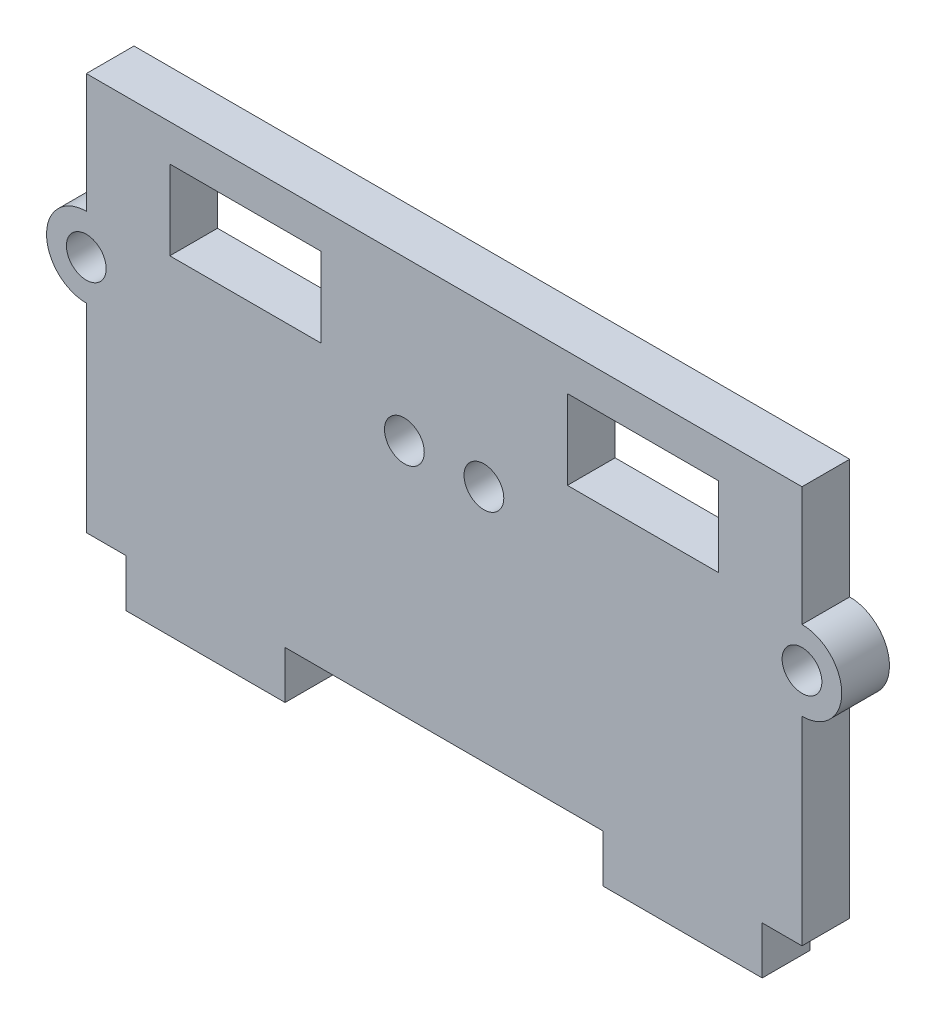
ISO-10303-21;
HEADER;
FILE_DESCRIPTION(('STEP AP214'),'2;1');
FILE_NAME('part.step','',(''),(''),'','','');
FILE_SCHEMA(('AUTOMOTIVE_DESIGN { 1 0 10303 214 1 1 1 1 }'));
ENDSEC;
DATA;
#1=APPLICATION_CONTEXT('core data for automotive mechanical design processes');
#2=APPLICATION_PROTOCOL_DEFINITION('international standard','automotive_design',2000,#1);
#3=PRODUCT_CONTEXT('',#1,'mechanical');
#4=PRODUCT('Part','Part','',(#3));
#5=PRODUCT_RELATED_PRODUCT_CATEGORY('part','',(#4));
#6=PRODUCT_DEFINITION_FORMATION('','',#4);
#7=PRODUCT_DEFINITION_CONTEXT('part definition',#1,'design');
#8=PRODUCT_DEFINITION('design','',#6,#7);
#9=PRODUCT_DEFINITION_SHAPE('','',#8);
#10=(LENGTH_UNIT() NAMED_UNIT(*) SI_UNIT(.MILLI.,.METRE.));
#11=(NAMED_UNIT(*) PLANE_ANGLE_UNIT() SI_UNIT($,.RADIAN.));
#12=(NAMED_UNIT(*) SI_UNIT($,.STERADIAN.) SOLID_ANGLE_UNIT());
#13=UNCERTAINTY_MEASURE_WITH_UNIT(LENGTH_MEASURE(1.E-05),#10,'distance_accuracy_value','');
#14=(GEOMETRIC_REPRESENTATION_CONTEXT(3) GLOBAL_UNCERTAINTY_ASSIGNED_CONTEXT((#13)) GLOBAL_UNIT_ASSIGNED_CONTEXT((#10,
#11,#12)) REPRESENTATION_CONTEXT('',''));
#15=CARTESIAN_POINT('',(0.,0.,0.));
#16=DIRECTION('',(0.,0.,1.));
#17=DIRECTION('',(1.,0.,0.));
#18=AXIS2_PLACEMENT_3D('',#15,#16,#17);
#19=CARTESIAN_POINT('',(0.,0.,1.5));
#20=DIRECTION('',(0.,0.,1.));
#21=DIRECTION('',(1.,0.,0.));
#22=AXIS2_PLACEMENT_3D('',#19,#20,#21);
#23=PLANE('',#22);
#24=CARTESIAN_POINT('',(10.,4.,1.5));
#25=DIRECTION('',(0.,0.,1.));
#26=DIRECTION('',(1.,0.,0.));
#27=AXIS2_PLACEMENT_3D('',#24,#25,#26);
#28=CIRCLE('',#27,1.25);
#29=CARTESIAN_POINT('',(11.25,4.,1.5));
#30=VERTEX_POINT('',#29);
#31=EDGE_CURVE('E324',#30,#30,#28,.T.);
#32=ORIENTED_EDGE('',*,*,#31,.F.);
#33=EDGE_LOOP('',(#32));
#34=FACE_BOUND('',#33,.T.);
#35=CARTESIAN_POINT('',(-10.,4.,1.5));
#36=DIRECTION('',(0.,0.,1.));
#37=DIRECTION('',(1.,0.,0.));
#38=AXIS2_PLACEMENT_3D('',#35,#36,#37);
#39=CIRCLE('',#38,1.25);
#40=CARTESIAN_POINT('',(-8.75,4.,1.5));
#41=VERTEX_POINT('',#40);
#42=EDGE_CURVE('E425',#41,#41,#39,.T.);
#43=ORIENTED_EDGE('',*,*,#42,.F.);
#44=EDGE_LOOP('',(#43));
#45=FACE_BOUND('',#44,.T.);
#46=DIRECTION('',(0.,1.,0.));
#47=VECTOR('',#46,1.);
#48=CARTESIAN_POINT('',(4.75,0.,1.5));
#49=LINE('',#48,#47);
#50=CARTESIAN_POINT('',(4.75,6.69999999999999,1.5));
#51=VERTEX_POINT('',#50);
#52=CARTESIAN_POINT('',(4.75,11.7,1.5));
#53=VERTEX_POINT('',#52);
#54=EDGE_CURVE('E429',#51,#53,#49,.T.);
#55=ORIENTED_EDGE('',*,*,#54,.F.);
#56=DIRECTION('',(1.,0.,0.));
#57=VECTOR('',#56,1.);
#58=CARTESIAN_POINT('',(0.,6.69999999999999,1.5));
#59=LINE('',#58,#57);
#60=CARTESIAN_POINT('',(-4.75,6.69999999999999,1.5));
#61=VERTEX_POINT('',#60);
#62=EDGE_CURVE('E433',#61,#51,#59,.T.);
#63=ORIENTED_EDGE('',*,*,#62,.F.);
#64=DIRECTION('',(0.,1.,0.));
#65=VECTOR('',#64,1.);
#66=CARTESIAN_POINT('',(-4.75,0.,1.5));
#67=LINE('',#66,#65);
#68=CARTESIAN_POINT('',(-4.75,11.7,1.5));
#69=VERTEX_POINT('',#68);
#70=EDGE_CURVE('E436',#61,#69,#67,.T.);
#71=ORIENTED_EDGE('',*,*,#70,.T.);
#72=DIRECTION('',(1.,0.,0.));
#73=VECTOR('',#72,1.);
#74=CARTESIAN_POINT('',(0.,11.7,1.5));
#75=LINE('',#74,#73);
#76=EDGE_CURVE('E239',#69,#53,#75,.T.);
#77=ORIENTED_EDGE('',*,*,#76,.T.);
#78=EDGE_LOOP('',(#55,#63,#71,#77));
#79=FACE_BOUND('',#78,.T.);
#80=CARTESIAN_POINT('',(15.,4.,1.5));
#81=DIRECTION('',(0.,0.,1.));
#82=DIRECTION('',(1.,0.,0.));
#83=AXIS2_PLACEMENT_3D('',#80,#81,#82);
#84=CIRCLE('',#83,1.25);
#85=CARTESIAN_POINT('',(16.25,4.,1.5));
#86=VERTEX_POINT('',#85);
#87=EDGE_CURVE('E236',#86,#86,#84,.F.);
#88=ORIENTED_EDGE('',*,*,#87,.T.);
#89=EDGE_LOOP('',(#88));
#90=FACE_BOUND('',#89,.T.);
#91=DIRECTION('',(0.,1.,0.));
#92=VECTOR('',#91,1.);
#93=CARTESIAN_POINT('',(29.75,0.,1.5));
#94=LINE('',#93,#92);
#95=CARTESIAN_POINT('',(29.75,6.69999999999999,1.5));
#96=VERTEX_POINT('',#95);
#97=CARTESIAN_POINT('',(29.75,11.7,1.5));
#98=VERTEX_POINT('',#97);
#99=EDGE_CURVE('E246',#96,#98,#94,.T.);
#100=ORIENTED_EDGE('',*,*,#99,.F.);
#101=DIRECTION('',(-1.,0.,0.));
#102=VECTOR('',#101,1.);
#103=CARTESIAN_POINT('',(0.,6.69999999999999,1.5));
#104=LINE('',#103,#102);
#105=CARTESIAN_POINT('',(20.25,6.69999999999999,1.5));
#106=VERTEX_POINT('',#105);
#107=EDGE_CURVE('E250',#96,#106,#104,.T.);
#108=ORIENTED_EDGE('',*,*,#107,.T.);
#109=DIRECTION('',(0.,1.,0.));
#110=VECTOR('',#109,1.);
#111=CARTESIAN_POINT('',(20.25,0.,1.5));
#112=LINE('',#111,#110);
#113=CARTESIAN_POINT('',(20.25,11.7,1.5));
#114=VERTEX_POINT('',#113);
#115=EDGE_CURVE('E254',#106,#114,#112,.T.);
#116=ORIENTED_EDGE('',*,*,#115,.T.);
#117=DIRECTION('',(-1.,0.,0.));
#118=VECTOR('',#117,1.);
#119=CARTESIAN_POINT('',(0.,11.7,1.5));
#120=LINE('',#119,#118);
#121=EDGE_CURVE('E257',#98,#114,#120,.T.);
#122=ORIENTED_EDGE('',*,*,#121,.F.);
#123=EDGE_LOOP('',(#100,#108,#116,#122));
#124=FACE_BOUND('',#123,.T.);
#125=CARTESIAN_POINT('',(35.,4.,1.5));
#126=DIRECTION('',(0.,0.,1.));
#127=DIRECTION('',(1.,0.,0.));
#128=AXIS2_PLACEMENT_3D('',#125,#126,#127);
#129=CIRCLE('',#128,1.25);
#130=CARTESIAN_POINT('',(36.25,4.,1.5));
#131=VERTEX_POINT('',#130);
#132=EDGE_CURVE('E261',#131,#131,#129,.F.);
#133=ORIENTED_EDGE('',*,*,#132,.T.);
#134=EDGE_LOOP('',(#133));
#135=FACE_BOUND('',#134,.T.);
#136=CARTESIAN_POINT('',(-10.,4.,1.5));
#137=DIRECTION('',(0.,0.,1.));
#138=DIRECTION('',(1.,0.,0.));
#139=AXIS2_PLACEMENT_3D('',#136,#137,#138);
#140=CIRCLE('',#139,2.5);
#141=CARTESIAN_POINT('',(-9.99999999999999,6.5,1.5));
#142=VERTEX_POINT('',#141);
#143=CARTESIAN_POINT('',(-9.99999999999999,1.5,1.5));
#144=VERTEX_POINT('',#143);
#145=EDGE_CURVE('E402',#142,#144,#140,.T.);
#146=ORIENTED_EDGE('',*,*,#145,.T.);
#147=DIRECTION('',(0.,-1.,0.));
#148=VECTOR('',#147,1.);
#149=CARTESIAN_POINT('',(-9.99999999999999,0.,1.5));
#150=LINE('',#149,#148);
#151=CARTESIAN_POINT('',(-9.99999999999999,-11.,1.5));
#152=VERTEX_POINT('',#151);
#153=EDGE_CURVE('E216',#144,#152,#150,.T.);
#154=ORIENTED_EDGE('',*,*,#153,.T.);
#155=DIRECTION('',(1.,0.,0.));
#156=VECTOR('',#155,1.);
#157=CARTESIAN_POINT('',(0.,-11.,1.5));
#158=LINE('',#157,#156);
#159=CARTESIAN_POINT('',(-7.5,-11.,1.5));
#160=VERTEX_POINT('',#159);
#161=EDGE_CURVE('E223',#152,#160,#158,.T.);
#162=ORIENTED_EDGE('',*,*,#161,.T.);
#163=DIRECTION('',(0.,-1.,0.));
#164=VECTOR('',#163,1.);
#165=CARTESIAN_POINT('',(-7.5,0.,1.5));
#166=LINE('',#165,#164);
#167=CARTESIAN_POINT('',(-7.5,-14.,1.5));
#168=VERTEX_POINT('',#167);
#169=EDGE_CURVE('E206',#160,#168,#166,.T.);
#170=ORIENTED_EDGE('',*,*,#169,.T.);
#171=DIRECTION('',(1.,0.,0.));
#172=VECTOR('',#171,1.);
#173=CARTESIAN_POINT('',(0.,-14.,1.5));
#174=LINE('',#173,#172);
#175=CARTESIAN_POINT('',(2.5,-14.,1.5));
#176=VERTEX_POINT('',#175);
#177=EDGE_CURVE('E220',#168,#176,#174,.T.);
#178=ORIENTED_EDGE('',*,*,#177,.T.);
#179=DIRECTION('',(0.,-1.,0.));
#180=VECTOR('',#179,1.);
#181=CARTESIAN_POINT('',(2.5,0.,1.5));
#182=LINE('',#181,#180);
#183=CARTESIAN_POINT('',(2.5,-11.,1.5));
#184=VERTEX_POINT('',#183);
#185=EDGE_CURVE('E57',#184,#176,#182,.T.);
#186=ORIENTED_EDGE('',*,*,#185,.F.);
#187=DIRECTION('',(1.,0.,0.));
#188=VECTOR('',#187,1.);
#189=CARTESIAN_POINT('',(0.,-11.,1.5));
#190=LINE('',#189,#188);
#191=CARTESIAN_POINT('',(22.5,-11.,1.5));
#192=VERTEX_POINT('',#191);
#193=EDGE_CURVE('E836',#184,#192,#190,.T.);
#194=ORIENTED_EDGE('',*,*,#193,.T.);
#195=DIRECTION('',(0.,-1.,0.));
#196=VECTOR('',#195,1.);
#197=CARTESIAN_POINT('',(22.5,0.,1.5));
#198=LINE('',#197,#196);
#199=CARTESIAN_POINT('',(22.5,-14.,1.5));
#200=VERTEX_POINT('',#199);
#201=EDGE_CURVE('E818',#192,#200,#198,.T.);
#202=ORIENTED_EDGE('',*,*,#201,.T.);
#203=CARTESIAN_POINT('',(32.5,-14.,1.5));
#204=VERTEX_POINT('',#203);
#205=EDGE_CURVE('E231',#200,#204,#174,.T.);
#206=ORIENTED_EDGE('',*,*,#205,.T.);
#207=DIRECTION('',(0.,-1.,0.));
#208=VECTOR('',#207,1.);
#209=CARTESIAN_POINT('',(32.5,0.,1.5));
#210=LINE('',#209,#208);
#211=CARTESIAN_POINT('',(32.5,-11.,1.5));
#212=VERTEX_POINT('',#211);
#213=EDGE_CURVE('E809',#212,#204,#210,.T.);
#214=ORIENTED_EDGE('',*,*,#213,.F.);
#215=DIRECTION('',(1.,0.,0.));
#216=VECTOR('',#215,1.);
#217=CARTESIAN_POINT('',(0.,-11.,1.5));
#218=LINE('',#217,#216);
#219=CARTESIAN_POINT('',(35.,-11.,1.5));
#220=VERTEX_POINT('',#219);
#221=EDGE_CURVE('E821',#212,#220,#218,.T.);
#222=ORIENTED_EDGE('',*,*,#221,.T.);
#223=DIRECTION('',(0.,-1.,0.));
#224=VECTOR('',#223,1.);
#225=CARTESIAN_POINT('',(35.,0.,1.5));
#226=LINE('',#225,#224);
#227=CARTESIAN_POINT('',(35.,1.49999999999999,1.5));
#228=VERTEX_POINT('',#227);
#229=EDGE_CURVE('E825',#228,#220,#226,.T.);
#230=ORIENTED_EDGE('',*,*,#229,.F.);
#231=CARTESIAN_POINT('',(35.,4.,1.5));
#232=DIRECTION('',(0.,0.,1.));
#233=DIRECTION('',(1.,0.,0.));
#234=AXIS2_PLACEMENT_3D('',#231,#232,#233);
#235=CIRCLE('',#234,2.5);
#236=CARTESIAN_POINT('',(35.,6.5,1.5));
#237=VERTEX_POINT('',#236);
#238=EDGE_CURVE('E390',#228,#237,#235,.T.);
#239=ORIENTED_EDGE('',*,*,#238,.T.);
#240=DIRECTION('',(0.,-1.,0.));
#241=VECTOR('',#240,1.);
#242=CARTESIAN_POINT('',(35.,0.,1.5));
#243=LINE('',#242,#241);
#244=CARTESIAN_POINT('',(35.,14.,1.5));
#245=VERTEX_POINT('',#244);
#246=EDGE_CURVE('E396',#245,#237,#243,.T.);
#247=ORIENTED_EDGE('',*,*,#246,.F.);
#248=DIRECTION('',(1.,0.,0.));
#249=VECTOR('',#248,1.);
#250=CARTESIAN_POINT('',(0.,14.,1.5));
#251=LINE('',#250,#249);
#252=CARTESIAN_POINT('',(-10.,14.,1.5));
#253=VERTEX_POINT('',#252);
#254=EDGE_CURVE('E230',#253,#245,#251,.T.);
#255=ORIENTED_EDGE('',*,*,#254,.F.);
#256=DIRECTION('',(0.,-1.,0.));
#257=VECTOR('',#256,1.);
#258=CARTESIAN_POINT('',(-9.99999999999999,0.,1.5));
#259=LINE('',#258,#257);
#260=EDGE_CURVE('E405',#253,#142,#259,.T.);
#261=ORIENTED_EDGE('',*,*,#260,.T.);
#262=EDGE_LOOP('',(#146,#154,#162,#170,#178,#186,#194,#202,#206,#214,#222,#230,#239,#247,#255,#261));
#263=FACE_BOUND('',#262,.T.);
#264=ADVANCED_FACE('F41',(#34,#45,#79,#90,#124,#135,#263),#23,.T.);
#265=CARTESIAN_POINT('',(0.,0.,-1.5));
#266=DIRECTION('',(0.,0.,1.));
#267=DIRECTION('',(1.,0.,0.));
#268=AXIS2_PLACEMENT_3D('',#265,#266,#267);
#269=PLANE('',#268);
#270=CARTESIAN_POINT('',(35.,4.,-1.5));
#271=DIRECTION('',(0.,0.,1.));
#272=DIRECTION('',(1.,0.,0.));
#273=AXIS2_PLACEMENT_3D('',#270,#271,#272);
#274=CIRCLE('',#273,1.25);
#275=CARTESIAN_POINT('',(36.25,4.,-1.5));
#276=VERTEX_POINT('',#275);
#277=EDGE_CURVE('E320',#276,#276,#274,.F.);
#278=ORIENTED_EDGE('',*,*,#277,.F.);
#279=EDGE_LOOP('',(#278));
#280=FACE_BOUND('',#279,.T.);
#281=DIRECTION('',(0.,1.,0.));
#282=VECTOR('',#281,1.);
#283=CARTESIAN_POINT('',(29.75,0.,-1.5));
#284=LINE('',#283,#282);
#285=CARTESIAN_POINT('',(29.75,6.69999999999999,-1.5));
#286=VERTEX_POINT('',#285);
#287=CARTESIAN_POINT('',(29.75,11.7,-1.5));
#288=VERTEX_POINT('',#287);
#289=EDGE_CURVE('E304',#286,#288,#284,.T.);
#290=ORIENTED_EDGE('',*,*,#289,.T.);
#291=DIRECTION('',(-1.,0.,0.));
#292=VECTOR('',#291,1.);
#293=CARTESIAN_POINT('',(0.,11.7,-1.5));
#294=LINE('',#293,#292);
#295=CARTESIAN_POINT('',(20.25,11.7,-1.5));
#296=VERTEX_POINT('',#295);
#297=EDGE_CURVE('E316',#288,#296,#294,.T.);
#298=ORIENTED_EDGE('',*,*,#297,.T.);
#299=DIRECTION('',(0.,1.,0.));
#300=VECTOR('',#299,1.);
#301=CARTESIAN_POINT('',(20.25,0.,-1.5));
#302=LINE('',#301,#300);
#303=CARTESIAN_POINT('',(20.25,6.69999999999999,-1.5));
#304=VERTEX_POINT('',#303);
#305=EDGE_CURVE('E312',#304,#296,#302,.T.);
#306=ORIENTED_EDGE('',*,*,#305,.F.);
#307=DIRECTION('',(-1.,0.,0.));
#308=VECTOR('',#307,1.);
#309=CARTESIAN_POINT('',(0.,6.69999999999999,-1.5));
#310=LINE('',#309,#308);
#311=EDGE_CURVE('E308',#286,#304,#310,.T.);
#312=ORIENTED_EDGE('',*,*,#311,.F.);
#313=EDGE_LOOP('',(#290,#298,#306,#312));
#314=FACE_BOUND('',#313,.T.);
#315=CARTESIAN_POINT('',(15.,4.,-1.5));
#316=DIRECTION('',(0.,0.,1.));
#317=DIRECTION('',(1.,0.,0.));
#318=AXIS2_PLACEMENT_3D('',#315,#316,#317);
#319=CIRCLE('',#318,1.25);
#320=CARTESIAN_POINT('',(16.25,4.,-1.5));
#321=VERTEX_POINT('',#320);
#322=EDGE_CURVE('E300',#321,#321,#319,.F.);
#323=ORIENTED_EDGE('',*,*,#322,.F.);
#324=EDGE_LOOP('',(#323));
#325=FACE_BOUND('',#324,.T.);
#326=DIRECTION('',(0.,1.,0.));
#327=VECTOR('',#326,1.);
#328=CARTESIAN_POINT('',(4.75,0.,-1.5));
#329=LINE('',#328,#327);
#330=CARTESIAN_POINT('',(4.75,6.69999999999999,-1.5));
#331=VERTEX_POINT('',#330);
#332=CARTESIAN_POINT('',(4.75,11.7,-1.5));
#333=VERTEX_POINT('',#332);
#334=EDGE_CURVE('E275',#331,#333,#329,.T.);
#335=ORIENTED_EDGE('',*,*,#334,.T.);
#336=DIRECTION('',(1.,0.,0.));
#337=VECTOR('',#336,1.);
#338=CARTESIAN_POINT('',(0.,11.7,-1.5));
#339=LINE('',#338,#337);
#340=CARTESIAN_POINT('',(-4.75,11.7,-1.5));
#341=VERTEX_POINT('',#340);
#342=EDGE_CURVE('E287',#341,#333,#339,.T.);
#343=ORIENTED_EDGE('',*,*,#342,.F.);
#344=DIRECTION('',(0.,1.,0.));
#345=VECTOR('',#344,1.);
#346=CARTESIAN_POINT('',(-4.75,0.,-1.5));
#347=LINE('',#346,#345);
#348=CARTESIAN_POINT('',(-4.75,6.69999999999999,-1.5));
#349=VERTEX_POINT('',#348);
#350=EDGE_CURVE('E283',#349,#341,#347,.T.);
#351=ORIENTED_EDGE('',*,*,#350,.F.);
#352=DIRECTION('',(1.,0.,0.));
#353=VECTOR('',#352,1.);
#354=CARTESIAN_POINT('',(0.,6.69999999999999,-1.5));
#355=LINE('',#354,#353);
#356=EDGE_CURVE('E279',#349,#331,#355,.T.);
#357=ORIENTED_EDGE('',*,*,#356,.T.);
#358=EDGE_LOOP('',(#335,#343,#351,#357));
#359=FACE_BOUND('',#358,.T.);
#360=CARTESIAN_POINT('',(-10.,4.,-1.5));
#361=DIRECTION('',(0.,0.,1.));
#362=DIRECTION('',(1.,0.,0.));
#363=AXIS2_PLACEMENT_3D('',#360,#361,#362);
#364=CIRCLE('',#363,1.25);
#365=CARTESIAN_POINT('',(-8.75,4.,-1.5));
#366=VERTEX_POINT('',#365);
#367=EDGE_CURVE('E270',#366,#366,#364,.T.);
#368=ORIENTED_EDGE('',*,*,#367,.T.);
#369=EDGE_LOOP('',(#368));
#370=FACE_BOUND('',#369,.T.);
#371=CARTESIAN_POINT('',(10.,4.,-1.5));
#372=DIRECTION('',(0.,0.,1.));
#373=DIRECTION('',(1.,0.,0.));
#374=AXIS2_PLACEMENT_3D('',#371,#372,#373);
#375=CIRCLE('',#374,1.25);
#376=CARTESIAN_POINT('',(11.25,4.,-1.5));
#377=VERTEX_POINT('',#376);
#378=EDGE_CURVE('E266',#377,#377,#375,.T.);
#379=ORIENTED_EDGE('',*,*,#378,.T.);
#380=EDGE_LOOP('',(#379));
#381=FACE_BOUND('',#380,.T.);
#382=DIRECTION('',(0.,-1.,0.));
#383=VECTOR('',#382,1.);
#384=CARTESIAN_POINT('',(-9.99999999999999,0.,-1.5));
#385=LINE('',#384,#383);
#386=CARTESIAN_POINT('',(-9.99999999999999,1.5,-1.5));
#387=VERTEX_POINT('',#386);
#388=CARTESIAN_POINT('',(-9.99999999999999,-11.,-1.5));
#389=VERTEX_POINT('',#388);
#390=EDGE_CURVE('E11',#387,#389,#385,.T.);
#391=ORIENTED_EDGE('',*,*,#390,.F.);
#392=CARTESIAN_POINT('',(-10.,4.,-1.5));
#393=DIRECTION('',(0.,0.,1.));
#394=DIRECTION('',(1.,0.,0.));
#395=AXIS2_PLACEMENT_3D('',#392,#393,#394);
#396=CIRCLE('',#395,2.5);
#397=CARTESIAN_POINT('',(-9.99999999999999,6.5,-1.5));
#398=VERTEX_POINT('',#397);
#399=EDGE_CURVE('E360',#398,#387,#396,.T.);
#400=ORIENTED_EDGE('',*,*,#399,.F.);
#401=DIRECTION('',(0.,-1.,0.));
#402=VECTOR('',#401,1.);
#403=CARTESIAN_POINT('',(-9.99999999999999,0.,-1.5));
#404=LINE('',#403,#402);
#405=CARTESIAN_POINT('',(-9.99999999999999,14.,-1.5));
#406=VERTEX_POINT('',#405);
#407=EDGE_CURVE('E357',#406,#398,#404,.T.);
#408=ORIENTED_EDGE('',*,*,#407,.F.);
#409=DIRECTION('',(1.,0.,0.));
#410=VECTOR('',#409,1.);
#411=CARTESIAN_POINT('',(0.,14.,-1.5));
#412=LINE('',#411,#410);
#413=CARTESIAN_POINT('',(35.,14.,-1.5));
#414=VERTEX_POINT('',#413);
#415=EDGE_CURVE('E296',#406,#414,#412,.T.);
#416=ORIENTED_EDGE('',*,*,#415,.T.);
#417=DIRECTION('',(0.,-1.,0.));
#418=VECTOR('',#417,1.);
#419=CARTESIAN_POINT('',(35.,0.,-1.5));
#420=LINE('',#419,#418);
#421=CARTESIAN_POINT('',(35.,6.5,-1.5));
#422=VERTEX_POINT('',#421);
#423=EDGE_CURVE('E339',#414,#422,#420,.T.);
#424=ORIENTED_EDGE('',*,*,#423,.T.);
#425=CARTESIAN_POINT('',(35.,4.,-1.5));
#426=DIRECTION('',(0.,0.,1.));
#427=DIRECTION('',(1.,0.,0.));
#428=AXIS2_PLACEMENT_3D('',#425,#426,#427);
#429=CIRCLE('',#428,2.5);
#430=CARTESIAN_POINT('',(35.,1.49999999999999,-1.5));
#431=VERTEX_POINT('',#430);
#432=EDGE_CURVE('E354',#431,#422,#429,.T.);
#433=ORIENTED_EDGE('',*,*,#432,.F.);
#434=DIRECTION('',(0.,-1.,0.));
#435=VECTOR('',#434,1.);
#436=CARTESIAN_POINT('',(35.,0.,-1.5));
#437=LINE('',#436,#435);
#438=CARTESIAN_POINT('',(35.,-11.,-1.5));
#439=VERTEX_POINT('',#438);
#440=EDGE_CURVE('E368',#431,#439,#437,.T.);
#441=ORIENTED_EDGE('',*,*,#440,.T.);
#442=DIRECTION('',(1.,0.,0.));
#443=VECTOR('',#442,1.);
#444=CARTESIAN_POINT('',(0.,-11.,-1.5));
#445=LINE('',#444,#443);
#446=CARTESIAN_POINT('',(32.5,-11.,-1.5));
#447=VERTEX_POINT('',#446);
#448=EDGE_CURVE('E372',#447,#439,#445,.T.);
#449=ORIENTED_EDGE('',*,*,#448,.F.);
#450=DIRECTION('',(0.,-1.,0.));
#451=VECTOR('',#450,1.);
#452=CARTESIAN_POINT('',(32.5,0.,-1.5));
#453=LINE('',#452,#451);
#454=CARTESIAN_POINT('',(32.5,-14.,-1.5));
#455=VERTEX_POINT('',#454);
#456=EDGE_CURVE('E794',#447,#455,#453,.T.);
#457=ORIENTED_EDGE('',*,*,#456,.T.);
#458=DIRECTION('',(1.,0.,0.));
#459=VECTOR('',#458,1.);
#460=CARTESIAN_POINT('',(0.,-14.,-1.5));
#461=LINE('',#460,#459);
#462=CARTESIAN_POINT('',(22.5,-14.,-1.5));
#463=VERTEX_POINT('',#462);
#464=EDGE_CURVE('E291',#463,#455,#461,.T.);
#465=ORIENTED_EDGE('',*,*,#464,.F.);
#466=DIRECTION('',(0.,-1.,0.));
#467=VECTOR('',#466,1.);
#468=CARTESIAN_POINT('',(22.5,0.,-1.5));
#469=LINE('',#468,#467);
#470=CARTESIAN_POINT('',(22.5,-11.,-1.5));
#471=VERTEX_POINT('',#470);
#472=EDGE_CURVE('E391',#471,#463,#469,.T.);
#473=ORIENTED_EDGE('',*,*,#472,.F.);
#474=DIRECTION('',(1.,0.,0.));
#475=VECTOR('',#474,1.);
#476=CARTESIAN_POINT('',(0.,-11.,-1.5));
#477=LINE('',#476,#475);
#478=CARTESIAN_POINT('',(2.5,-11.,-1.5));
#479=VERTEX_POINT('',#478);
#480=EDGE_CURVE('E375',#479,#471,#477,.T.);
#481=ORIENTED_EDGE('',*,*,#480,.F.);
#482=DIRECTION('',(0.,-1.,0.));
#483=VECTOR('',#482,1.);
#484=CARTESIAN_POINT('',(2.5,0.,-1.5));
#485=LINE('',#484,#483);
#486=CARTESIAN_POINT('',(2.5,-14.,-1.5));
#487=VERTEX_POINT('',#486);
#488=EDGE_CURVE('E398',#479,#487,#485,.T.);
#489=ORIENTED_EDGE('',*,*,#488,.T.);
#490=CARTESIAN_POINT('',(-7.5,-14.,-1.5));
#491=VERTEX_POINT('',#490);
#492=EDGE_CURVE('E295',#491,#487,#461,.T.);
#493=ORIENTED_EDGE('',*,*,#492,.F.);
#494=DIRECTION('',(0.,-1.,0.));
#495=VECTOR('',#494,1.);
#496=CARTESIAN_POINT('',(-7.5,0.,-1.5));
#497=LINE('',#496,#495);
#498=CARTESIAN_POINT('',(-7.5,-11.,-1.5));
#499=VERTEX_POINT('',#498);
#500=EDGE_CURVE('E209',#499,#491,#497,.T.);
#501=ORIENTED_EDGE('',*,*,#500,.F.);
#502=DIRECTION('',(1.,0.,0.));
#503=VECTOR('',#502,1.);
#504=CARTESIAN_POINT('',(0.,-11.,-1.5));
#505=LINE('',#504,#503);
#506=EDGE_CURVE('E50',#389,#499,#505,.T.);
#507=ORIENTED_EDGE('',*,*,#506,.F.);
#508=EDGE_LOOP('',(#391,#400,#408,#416,#424,#433,#441,#449,#457,#465,#473,#481,#489,#493,#501,#507));
#509=FACE_BOUND('',#508,.T.);
#510=ADVANCED_FACE('F387',(#280,#314,#325,#359,#370,#381,#509),#269,.F.);
#511=CARTESIAN_POINT('',(0.,-14.,1.5));
#512=DIRECTION('',(0.,1.,0.));
#513=DIRECTION('',(0.,0.,1.));
#514=AXIS2_PLACEMENT_3D('',#511,#512,#513);
#515=PLANE('',#514);
#516=DIRECTION('',(0.,0.,1.));
#517=VECTOR('',#516,1.);
#518=CARTESIAN_POINT('',(-7.5,-14.,-8.5));
#519=LINE('',#518,#517);
#520=EDGE_CURVE('E202',#491,#168,#519,.T.);
#521=ORIENTED_EDGE('',*,*,#520,.F.);
#522=ORIENTED_EDGE('',*,*,#492,.T.);
#523=DIRECTION('',(0.,0.,1.));
#524=VECTOR('',#523,1.);
#525=CARTESIAN_POINT('',(2.5,-14.,1.5));
#526=LINE('',#525,#524);
#527=EDGE_CURVE('E228',#487,#176,#526,.T.);
#528=ORIENTED_EDGE('',*,*,#527,.T.);
#529=ORIENTED_EDGE('',*,*,#177,.F.);
#530=EDGE_LOOP('',(#521,#522,#528,#529));
#531=FACE_BOUND('',#530,.T.);
#532=ADVANCED_FACE('F227',(#531),#515,.F.);
#533=DIRECTION('',(0.,0.,1.));
#534=VECTOR('',#533,1.);
#535=CARTESIAN_POINT('',(22.5,-14.,1.5));
#536=LINE('',#535,#534);
#537=EDGE_CURVE('E365',#463,#200,#536,.T.);
#538=ORIENTED_EDGE('',*,*,#537,.F.);
#539=ORIENTED_EDGE('',*,*,#464,.T.);
#540=DIRECTION('',(0.,0.,1.));
#541=VECTOR('',#540,1.);
#542=CARTESIAN_POINT('',(32.5,-14.,-8.5));
#543=LINE('',#542,#541);
#544=EDGE_CURVE('E815',#455,#204,#543,.T.);
#545=ORIENTED_EDGE('',*,*,#544,.T.);
#546=ORIENTED_EDGE('',*,*,#205,.F.);
#547=EDGE_LOOP('',(#538,#539,#545,#546));
#548=FACE_BOUND('',#547,.T.);
#549=ADVANCED_FACE('F512',(#548),#515,.F.);
#550=CARTESIAN_POINT('',(0.,14.,1.5));
#551=DIRECTION('',(0.,1.,0.));
#552=DIRECTION('',(0.,0.,1.));
#553=AXIS2_PLACEMENT_3D('',#550,#551,#552);
#554=PLANE('',#553);
#555=ORIENTED_EDGE('',*,*,#415,.F.);
#556=DIRECTION('',(0.,0.,1.));
#557=VECTOR('',#556,1.);
#558=CARTESIAN_POINT('',(-10.,14.,-8.5));
#559=LINE('',#558,#557);
#560=EDGE_CURVE('E271',#406,#253,#559,.T.);
#561=ORIENTED_EDGE('',*,*,#560,.T.);
#562=ORIENTED_EDGE('',*,*,#254,.T.);
#563=DIRECTION('',(0.,0.,1.));
#564=VECTOR('',#563,1.);
#565=CARTESIAN_POINT('',(35.,14.,-8.5));
#566=LINE('',#565,#564);
#567=EDGE_CURVE('E417',#414,#245,#566,.T.);
#568=ORIENTED_EDGE('',*,*,#567,.F.);
#569=EDGE_LOOP('',(#555,#561,#562,#568));
#570=FACE_BOUND('',#569,.T.);
#571=ADVANCED_FACE('F505',(#570),#554,.T.);
#572=CARTESIAN_POINT('',(29.75,0.,1.5));
#573=DIRECTION('',(-1.,0.,0.));
#574=DIRECTION('',(0.,0.,1.));
#575=AXIS2_PLACEMENT_3D('',#572,#573,#574);
#576=PLANE('',#575);
#577=ORIENTED_EDGE('',*,*,#289,.F.);
#578=DIRECTION('',(0.,0.,-1.));
#579=VECTOR('',#578,1.);
#580=CARTESIAN_POINT('',(29.75,6.69999999999999,1.5));
#581=LINE('',#580,#579);
#582=EDGE_CURVE('E336',#96,#286,#581,.T.);
#583=ORIENTED_EDGE('',*,*,#582,.F.);
#584=ORIENTED_EDGE('',*,*,#99,.T.);
#585=DIRECTION('',(0.,0.,-1.));
#586=VECTOR('',#585,1.);
#587=CARTESIAN_POINT('',(29.75,11.7,1.5));
#588=LINE('',#587,#586);
#589=EDGE_CURVE('E325',#98,#288,#588,.T.);
#590=ORIENTED_EDGE('',*,*,#589,.T.);
#591=EDGE_LOOP('',(#577,#583,#584,#590));
#592=FACE_BOUND('',#591,.T.);
#593=ADVANCED_FACE('F501',(#592),#576,.T.);
#594=CARTESIAN_POINT('',(0.,6.69999999999999,1.5));
#595=DIRECTION('',(0.,-1.,0.));
#596=DIRECTION('',(0.,0.,-1.));
#597=AXIS2_PLACEMENT_3D('',#594,#595,#596);
#598=PLANE('',#597);
#599=ORIENTED_EDGE('',*,*,#311,.T.);
#600=DIRECTION('',(0.,0.,-1.));
#601=VECTOR('',#600,1.);
#602=CARTESIAN_POINT('',(20.25,6.69999999999999,1.5));
#603=LINE('',#602,#601);
#604=EDGE_CURVE('E332',#106,#304,#603,.T.);
#605=ORIENTED_EDGE('',*,*,#604,.F.);
#606=ORIENTED_EDGE('',*,*,#107,.F.);
#607=ORIENTED_EDGE('',*,*,#582,.T.);
#608=EDGE_LOOP('',(#599,#605,#606,#607));
#609=FACE_BOUND('',#608,.T.);
#610=ADVANCED_FACE('F497',(#609),#598,.F.);
#611=CARTESIAN_POINT('',(20.25,0.,1.5));
#612=DIRECTION('',(-1.,0.,0.));
#613=DIRECTION('',(0.,0.,1.));
#614=AXIS2_PLACEMENT_3D('',#611,#612,#613);
#615=PLANE('',#614);
#616=ORIENTED_EDGE('',*,*,#305,.T.);
#617=DIRECTION('',(0.,0.,-1.));
#618=VECTOR('',#617,1.);
#619=CARTESIAN_POINT('',(20.25,11.7,1.5));
#620=LINE('',#619,#618);
#621=EDGE_CURVE('E328',#114,#296,#620,.T.);
#622=ORIENTED_EDGE('',*,*,#621,.F.);
#623=ORIENTED_EDGE('',*,*,#115,.F.);
#624=ORIENTED_EDGE('',*,*,#604,.T.);
#625=EDGE_LOOP('',(#616,#622,#623,#624));
#626=FACE_BOUND('',#625,.T.);
#627=ADVANCED_FACE('F494',(#626),#615,.F.);
#628=CARTESIAN_POINT('',(4.75,0.,1.5));
#629=DIRECTION('',(-1.,0.,0.));
#630=DIRECTION('',(0.,0.,1.));
#631=AXIS2_PLACEMENT_3D('',#628,#629,#630);
#632=PLANE('',#631);
#633=ORIENTED_EDGE('',*,*,#334,.F.);
#634=DIRECTION('',(0.,0.,-1.));
#635=VECTOR('',#634,1.);
#636=CARTESIAN_POINT('',(4.75,6.69999999999999,1.5));
#637=LINE('',#636,#635);
#638=EDGE_CURVE('E329',#51,#331,#637,.T.);
#639=ORIENTED_EDGE('',*,*,#638,.F.);
#640=ORIENTED_EDGE('',*,*,#54,.T.);
#641=DIRECTION('',(0.,0.,-1.));
#642=VECTOR('',#641,1.);
#643=CARTESIAN_POINT('',(4.75,11.7,1.5));
#644=LINE('',#643,#642);
#645=EDGE_CURVE('E265',#53,#333,#644,.T.);
#646=ORIENTED_EDGE('',*,*,#645,.T.);
#647=EDGE_LOOP('',(#633,#639,#640,#646));
#648=FACE_BOUND('',#647,.T.);
#649=ADVANCED_FACE('F451',(#648),#632,.T.);
#650=CARTESIAN_POINT('',(0.,6.69999999999999,1.5));
#651=DIRECTION('',(0.,1.,0.));
#652=DIRECTION('',(0.,0.,1.));
#653=AXIS2_PLACEMENT_3D('',#650,#651,#652);
#654=PLANE('',#653);
#655=ORIENTED_EDGE('',*,*,#356,.F.);
#656=DIRECTION('',(0.,0.,-1.));
#657=VECTOR('',#656,1.);
#658=CARTESIAN_POINT('',(-4.75,6.69999999999999,1.5));
#659=LINE('',#658,#657);
#660=EDGE_CURVE('E346',#61,#349,#659,.T.);
#661=ORIENTED_EDGE('',*,*,#660,.F.);
#662=ORIENTED_EDGE('',*,*,#62,.T.);
#663=ORIENTED_EDGE('',*,*,#638,.T.);
#664=EDGE_LOOP('',(#655,#661,#662,#663));
#665=FACE_BOUND('',#664,.T.);
#666=ADVANCED_FACE('F454',(#665),#654,.T.);
#667=CARTESIAN_POINT('',(-4.75,0.,1.5));
#668=DIRECTION('',(-1.,0.,0.));
#669=DIRECTION('',(0.,0.,1.));
#670=AXIS2_PLACEMENT_3D('',#667,#668,#669);
#671=PLANE('',#670);
#672=ORIENTED_EDGE('',*,*,#350,.T.);
#673=DIRECTION('',(0.,0.,-1.));
#674=VECTOR('',#673,1.);
#675=CARTESIAN_POINT('',(-4.75,11.7,1.5));
#676=LINE('',#675,#674);
#677=EDGE_CURVE('E342',#69,#341,#676,.T.);
#678=ORIENTED_EDGE('',*,*,#677,.F.);
#679=ORIENTED_EDGE('',*,*,#70,.F.);
#680=ORIENTED_EDGE('',*,*,#660,.T.);
#681=EDGE_LOOP('',(#672,#678,#679,#680));
#682=FACE_BOUND('',#681,.T.);
#683=ADVANCED_FACE('F457',(#682),#671,.F.);
#684=CARTESIAN_POINT('',(0.,11.7,1.5));
#685=DIRECTION('',(0.,-1.,0.));
#686=DIRECTION('',(0.,0.,-1.));
#687=AXIS2_PLACEMENT_3D('',#684,#685,#686);
#688=PLANE('',#687);
#689=ORIENTED_EDGE('',*,*,#297,.F.);
#690=ORIENTED_EDGE('',*,*,#589,.F.);
#691=ORIENTED_EDGE('',*,*,#121,.T.);
#692=ORIENTED_EDGE('',*,*,#621,.T.);
#693=EDGE_LOOP('',(#689,#690,#691,#692));
#694=FACE_BOUND('',#693,.T.);
#695=ADVANCED_FACE('F489',(#694),#688,.T.);
#696=CARTESIAN_POINT('',(15.,4.,1.5));
#697=DIRECTION('',(0.,0.,-1.));
#698=DIRECTION('',(-1.,0.,0.));
#699=AXIS2_PLACEMENT_3D('',#696,#697,#698);
#700=CYLINDRICAL_SURFACE('',#699,1.25);
#701=ORIENTED_EDGE('',*,*,#87,.F.);
#702=EDGE_LOOP('',(#701));
#703=FACE_BOUND('',#702,.T.);
#704=ORIENTED_EDGE('',*,*,#322,.T.);
#705=EDGE_LOOP('',(#704));
#706=FACE_BOUND('',#705,.T.);
#707=ADVANCED_FACE('F492',(#703,#706),#700,.F.);
#708=CARTESIAN_POINT('',(0.,11.7,1.5));
#709=DIRECTION('',(0.,1.,0.));
#710=DIRECTION('',(0.,0.,1.));
#711=AXIS2_PLACEMENT_3D('',#708,#709,#710);
#712=PLANE('',#711);
#713=ORIENTED_EDGE('',*,*,#342,.T.);
#714=ORIENTED_EDGE('',*,*,#645,.F.);
#715=ORIENTED_EDGE('',*,*,#76,.F.);
#716=ORIENTED_EDGE('',*,*,#677,.T.);
#717=EDGE_LOOP('',(#713,#714,#715,#716));
#718=FACE_BOUND('',#717,.T.);
#719=ADVANCED_FACE('F448',(#718),#712,.F.);
#720=CARTESIAN_POINT('',(-10.,4.,1.5));
#721=DIRECTION('',(0.,0.,-1.));
#722=DIRECTION('',(-1.,0.,0.));
#723=AXIS2_PLACEMENT_3D('',#720,#721,#722);
#724=CYLINDRICAL_SURFACE('',#723,1.25);
#725=ORIENTED_EDGE('',*,*,#42,.T.);
#726=EDGE_LOOP('',(#725));
#727=FACE_BOUND('',#726,.T.);
#728=ORIENTED_EDGE('',*,*,#367,.F.);
#729=EDGE_LOOP('',(#728));
#730=FACE_BOUND('',#729,.T.);
#731=ADVANCED_FACE('F469',(#727,#730),#724,.F.);
#732=CARTESIAN_POINT('',(10.,4.,1.5));
#733=DIRECTION('',(0.,0.,-1.));
#734=DIRECTION('',(-1.,0.,0.));
#735=AXIS2_PLACEMENT_3D('',#732,#733,#734);
#736=CYLINDRICAL_SURFACE('',#735,1.25);
#737=ORIENTED_EDGE('',*,*,#31,.T.);
#738=EDGE_LOOP('',(#737));
#739=FACE_BOUND('',#738,.T.);
#740=ORIENTED_EDGE('',*,*,#378,.F.);
#741=EDGE_LOOP('',(#740));
#742=FACE_BOUND('',#741,.T.);
#743=ADVANCED_FACE('F43',(#739,#742),#736,.F.);
#744=CARTESIAN_POINT('',(35.,4.,1.5));
#745=DIRECTION('',(0.,0.,-1.));
#746=DIRECTION('',(-1.,0.,0.));
#747=AXIS2_PLACEMENT_3D('',#744,#745,#746);
#748=CYLINDRICAL_SURFACE('',#747,1.25);
#749=ORIENTED_EDGE('',*,*,#132,.F.);
#750=EDGE_LOOP('',(#749));
#751=FACE_BOUND('',#750,.T.);
#752=ORIENTED_EDGE('',*,*,#277,.T.);
#753=EDGE_LOOP('',(#752));
#754=FACE_BOUND('',#753,.T.);
#755=ADVANCED_FACE('F468',(#751,#754),#748,.F.);
#756=CARTESIAN_POINT('',(35.,4.,-8.5));
#757=DIRECTION('',(0.,0.,1.));
#758=DIRECTION('',(1.,0.,0.));
#759=AXIS2_PLACEMENT_3D('',#756,#757,#758);
#760=CYLINDRICAL_SURFACE('',#759,2.5);
#761=ORIENTED_EDGE('',*,*,#432,.T.);
#762=DIRECTION('',(0.,0.,1.));
#763=VECTOR('',#762,1.);
#764=CARTESIAN_POINT('',(35.,6.5,-8.5));
#765=LINE('',#764,#763);
#766=EDGE_CURVE('E65',#422,#237,#765,.T.);
#767=ORIENTED_EDGE('',*,*,#766,.T.);
#768=ORIENTED_EDGE('',*,*,#238,.F.);
#769=DIRECTION('',(0.,0.,1.));
#770=VECTOR('',#769,1.);
#771=CARTESIAN_POINT('',(35.,1.49999999999999,-8.5));
#772=LINE('',#771,#770);
#773=EDGE_CURVE('E804',#431,#228,#772,.T.);
#774=ORIENTED_EDGE('',*,*,#773,.F.);
#775=EDGE_LOOP('',(#761,#767,#768,#774));
#776=FACE_BOUND('',#775,.T.);
#777=ADVANCED_FACE('F475',(#776),#760,.T.);
#778=CARTESIAN_POINT('',(35.,0.,-8.5));
#779=DIRECTION('',(-1.,0.,0.));
#780=DIRECTION('',(0.,0.,1.));
#781=AXIS2_PLACEMENT_3D('',#778,#779,#780);
#782=PLANE('',#781);
#783=ORIENTED_EDGE('',*,*,#567,.T.);
#784=ORIENTED_EDGE('',*,*,#246,.T.);
#785=ORIENTED_EDGE('',*,*,#766,.F.);
#786=ORIENTED_EDGE('',*,*,#423,.F.);
#787=EDGE_LOOP('',(#783,#784,#785,#786));
#788=FACE_BOUND('',#787,.T.);
#789=ADVANCED_FACE('F561',(#788),#782,.F.);
#790=CARTESIAN_POINT('',(-10.,4.,-8.5));
#791=DIRECTION('',(0.,0.,1.));
#792=DIRECTION('',(1.,0.,0.));
#793=AXIS2_PLACEMENT_3D('',#790,#791,#792);
#794=CYLINDRICAL_SURFACE('',#793,2.5);
#795=ORIENTED_EDGE('',*,*,#399,.T.);
#796=DIRECTION('',(0.,0.,1.));
#797=VECTOR('',#796,1.);
#798=CARTESIAN_POINT('',(-9.99999999999999,1.5,-8.5));
#799=LINE('',#798,#797);
#800=EDGE_CURVE('E797',#387,#144,#799,.T.);
#801=ORIENTED_EDGE('',*,*,#800,.T.);
#802=ORIENTED_EDGE('',*,*,#145,.F.);
#803=DIRECTION('',(0.,0.,1.));
#804=VECTOR('',#803,1.);
#805=CARTESIAN_POINT('',(-9.99999999999999,6.5,-8.5));
#806=LINE('',#805,#804);
#807=EDGE_CURVE('E409',#398,#142,#806,.T.);
#808=ORIENTED_EDGE('',*,*,#807,.F.);
#809=EDGE_LOOP('',(#795,#801,#802,#808));
#810=FACE_BOUND('',#809,.T.);
#811=ADVANCED_FACE('F570',(#810),#794,.T.);
#812=CARTESIAN_POINT('',(-9.99999999999999,0.,-8.5));
#813=DIRECTION('',(-1.,0.,0.));
#814=DIRECTION('',(0.,-1.,0.));
#815=AXIS2_PLACEMENT_3D('',#812,#813,#814);
#816=PLANE('',#815);
#817=ORIENTED_EDGE('',*,*,#407,.T.);
#818=ORIENTED_EDGE('',*,*,#807,.T.);
#819=ORIENTED_EDGE('',*,*,#260,.F.);
#820=ORIENTED_EDGE('',*,*,#560,.F.);
#821=EDGE_LOOP('',(#817,#818,#819,#820));
#822=FACE_BOUND('',#821,.T.);
#823=ADVANCED_FACE('F577',(#822),#816,.T.);
#824=CARTESIAN_POINT('',(-9.99999999999999,0.,-8.5));
#825=DIRECTION('',(-1.,0.,0.));
#826=DIRECTION('',(0.,-1.,0.));
#827=AXIS2_PLACEMENT_3D('',#824,#825,#826);
#828=PLANE('',#827);
#829=ORIENTED_EDGE('',*,*,#390,.T.);
#830=DIRECTION('',(0.,0.,1.));
#831=VECTOR('',#830,1.);
#832=CARTESIAN_POINT('',(-9.99999999999999,-11.,-8.5));
#833=LINE('',#832,#831);
#834=EDGE_CURVE('E382',#389,#152,#833,.T.);
#835=ORIENTED_EDGE('',*,*,#834,.T.);
#836=ORIENTED_EDGE('',*,*,#153,.F.);
#837=ORIENTED_EDGE('',*,*,#800,.F.);
#838=EDGE_LOOP('',(#829,#835,#836,#837));
#839=FACE_BOUND('',#838,.T.);
#840=ADVANCED_FACE('F586',(#839),#828,.T.);
#841=CARTESIAN_POINT('',(0.,-11.,-8.5));
#842=DIRECTION('',(0.,-1.,0.));
#843=DIRECTION('',(0.,0.,-1.));
#844=AXIS2_PLACEMENT_3D('',#841,#842,#843);
#845=PLANE('',#844);
#846=ORIENTED_EDGE('',*,*,#506,.T.);
#847=DIRECTION('',(0.,0.,1.));
#848=VECTOR('',#847,1.);
#849=CARTESIAN_POINT('',(-7.5,-11.,-8.5));
#850=LINE('',#849,#848);
#851=EDGE_CURVE('E215',#499,#160,#850,.T.);
#852=ORIENTED_EDGE('',*,*,#851,.T.);
#853=ORIENTED_EDGE('',*,*,#161,.F.);
#854=ORIENTED_EDGE('',*,*,#834,.F.);
#855=EDGE_LOOP('',(#846,#852,#853,#854));
#856=FACE_BOUND('',#855,.T.);
#857=ADVANCED_FACE('F381',(#856),#845,.T.);
#858=CARTESIAN_POINT('',(-7.5,0.,-8.5));
#859=DIRECTION('',(-1.,0.,0.));
#860=DIRECTION('',(0.,0.,1.));
#861=AXIS2_PLACEMENT_3D('',#858,#859,#860);
#862=PLANE('',#861);
#863=ORIENTED_EDGE('',*,*,#500,.T.);
#864=ORIENTED_EDGE('',*,*,#520,.T.);
#865=ORIENTED_EDGE('',*,*,#169,.F.);
#866=ORIENTED_EDGE('',*,*,#851,.F.);
#867=EDGE_LOOP('',(#863,#864,#865,#866));
#868=FACE_BOUND('',#867,.T.);
#869=ADVANCED_FACE('F204',(#868),#862,.T.);
#870=CARTESIAN_POINT('',(0.,-11.,-8.5));
#871=DIRECTION('',(0.,-1.,0.));
#872=DIRECTION('',(0.,0.,-1.));
#873=AXIS2_PLACEMENT_3D('',#870,#871,#872);
#874=PLANE('',#873);
#875=ORIENTED_EDGE('',*,*,#448,.T.);
#876=DIRECTION('',(0.,0.,1.));
#877=VECTOR('',#876,1.);
#878=CARTESIAN_POINT('',(35.,-11.,-8.5));
#879=LINE('',#878,#877);
#880=EDGE_CURVE('E808',#439,#220,#879,.T.);
#881=ORIENTED_EDGE('',*,*,#880,.T.);
#882=ORIENTED_EDGE('',*,*,#221,.F.);
#883=DIRECTION('',(0.,0.,1.));
#884=VECTOR('',#883,1.);
#885=CARTESIAN_POINT('',(32.5,-11.,-8.5));
#886=LINE('',#885,#884);
#887=EDGE_CURVE('E812',#447,#212,#886,.T.);
#888=ORIENTED_EDGE('',*,*,#887,.F.);
#889=EDGE_LOOP('',(#875,#881,#882,#888));
#890=FACE_BOUND('',#889,.T.);
#891=ADVANCED_FACE('F610',(#890),#874,.T.);
#892=CARTESIAN_POINT('',(35.,0.,-8.5));
#893=DIRECTION('',(-1.,0.,0.));
#894=DIRECTION('',(0.,0.,1.));
#895=AXIS2_PLACEMENT_3D('',#892,#893,#894);
#896=PLANE('',#895);
#897=ORIENTED_EDGE('',*,*,#773,.T.);
#898=ORIENTED_EDGE('',*,*,#229,.T.);
#899=ORIENTED_EDGE('',*,*,#880,.F.);
#900=ORIENTED_EDGE('',*,*,#440,.F.);
#901=EDGE_LOOP('',(#897,#898,#899,#900));
#902=FACE_BOUND('',#901,.T.);
#903=ADVANCED_FACE('F618',(#902),#896,.F.);
#904=CARTESIAN_POINT('',(32.5,0.,-8.5));
#905=DIRECTION('',(-1.,0.,0.));
#906=DIRECTION('',(0.,0.,1.));
#907=AXIS2_PLACEMENT_3D('',#904,#905,#906);
#908=PLANE('',#907);
#909=ORIENTED_EDGE('',*,*,#887,.T.);
#910=ORIENTED_EDGE('',*,*,#213,.T.);
#911=ORIENTED_EDGE('',*,*,#544,.F.);
#912=ORIENTED_EDGE('',*,*,#456,.F.);
#913=EDGE_LOOP('',(#909,#910,#911,#912));
#914=FACE_BOUND('',#913,.T.);
#915=ADVANCED_FACE('F627',(#914),#908,.F.);
#916=CARTESIAN_POINT('',(0.,-11.,-8.5));
#917=DIRECTION('',(0.,-1.,0.));
#918=DIRECTION('',(0.,0.,-1.));
#919=AXIS2_PLACEMENT_3D('',#916,#917,#918);
#920=PLANE('',#919);
#921=ORIENTED_EDGE('',*,*,#480,.T.);
#922=DIRECTION('',(0.,0.,1.));
#923=VECTOR('',#922,1.);
#924=CARTESIAN_POINT('',(22.5,-11.,-8.5));
#925=LINE('',#924,#923);
#926=EDGE_CURVE('E829',#471,#192,#925,.T.);
#927=ORIENTED_EDGE('',*,*,#926,.T.);
#928=ORIENTED_EDGE('',*,*,#193,.F.);
#929=DIRECTION('',(0.,0.,1.));
#930=VECTOR('',#929,1.);
#931=CARTESIAN_POINT('',(2.5,-11.,-8.5));
#932=LINE('',#931,#930);
#933=EDGE_CURVE('E225',#479,#184,#932,.T.);
#934=ORIENTED_EDGE('',*,*,#933,.F.);
#935=EDGE_LOOP('',(#921,#927,#928,#934));
#936=FACE_BOUND('',#935,.T.);
#937=ADVANCED_FACE('F636',(#936),#920,.T.);
#938=CARTESIAN_POINT('',(22.5,0.,-8.5));
#939=DIRECTION('',(-1.,0.,0.));
#940=DIRECTION('',(0.,-1.,0.));
#941=AXIS2_PLACEMENT_3D('',#938,#939,#940);
#942=PLANE('',#941);
#943=ORIENTED_EDGE('',*,*,#472,.T.);
#944=ORIENTED_EDGE('',*,*,#537,.T.);
#945=ORIENTED_EDGE('',*,*,#201,.F.);
#946=ORIENTED_EDGE('',*,*,#926,.F.);
#947=EDGE_LOOP('',(#943,#944,#945,#946));
#948=FACE_BOUND('',#947,.T.);
#949=ADVANCED_FACE('F645',(#948),#942,.T.);
#950=CARTESIAN_POINT('',(2.5,0.,-8.5));
#951=DIRECTION('',(-1.,0.,0.));
#952=DIRECTION('',(0.,0.,1.));
#953=AXIS2_PLACEMENT_3D('',#950,#951,#952);
#954=PLANE('',#953);
#955=ORIENTED_EDGE('',*,*,#933,.T.);
#956=ORIENTED_EDGE('',*,*,#185,.T.);
#957=ORIENTED_EDGE('',*,*,#527,.F.);
#958=ORIENTED_EDGE('',*,*,#488,.F.);
#959=EDGE_LOOP('',(#955,#956,#957,#958));
#960=FACE_BOUND('',#959,.T.);
#961=ADVANCED_FACE('F654',(#960),#954,.F.);
#962=CLOSED_SHELL('',(#264,#510,#532,#549,#571,#593,#610,#627,#649,#666,#683,#695,#707,#719,
#731,#743,#755,#777,#789,#811,#823,#840,#857,#869,#891,#903,#915,#937,#949,#961));
#963=MANIFOLD_SOLID_BREP('B2',#962);
#964=ADVANCED_BREP_SHAPE_REPRESENTATION('',(#18,#963),#14);
#965=SHAPE_DEFINITION_REPRESENTATION(#9,#964);
ENDSEC;
END-ISO-10303-21;
